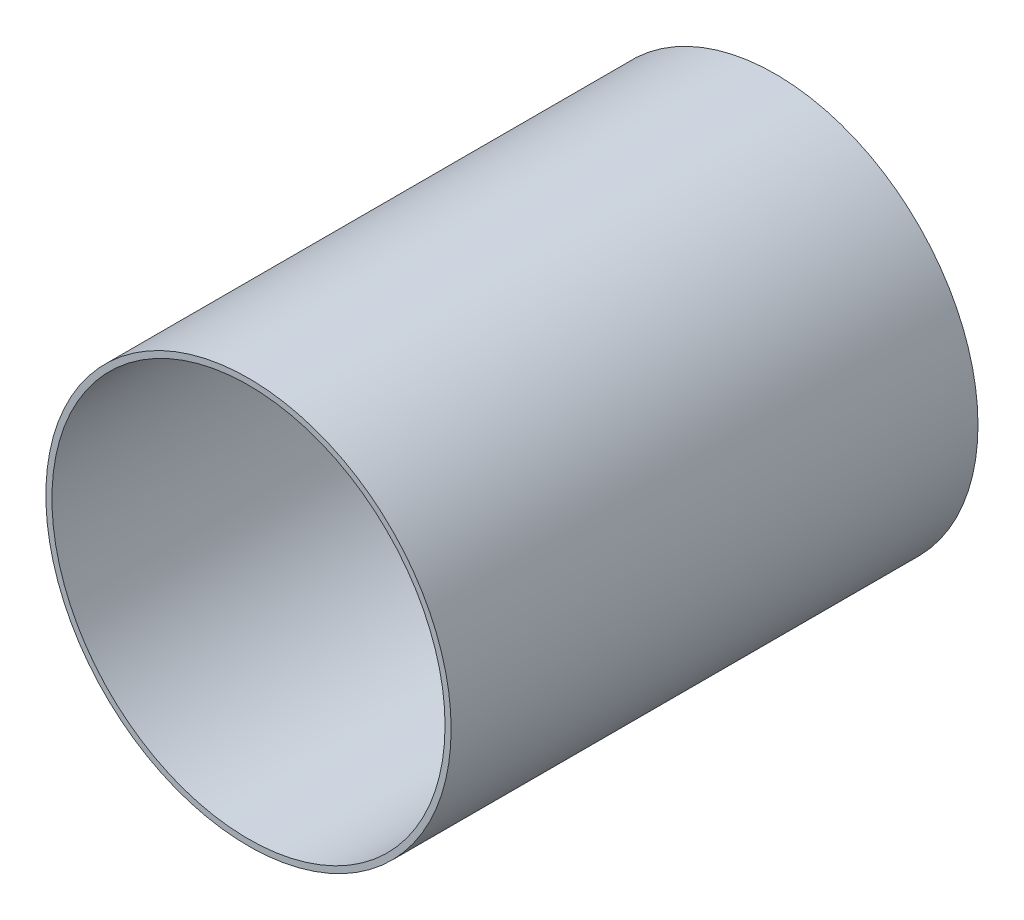
ISO-10303-21;
HEADER;
FILE_DESCRIPTION(('STEP AP214'),'2;1');
FILE_NAME('part.step','',(''),(''),'','','');
FILE_SCHEMA(('AUTOMOTIVE_DESIGN { 1 0 10303 214 1 1 1 1 }'));
ENDSEC;
DATA;
#1=APPLICATION_CONTEXT('core data for automotive mechanical design processes');
#2=APPLICATION_PROTOCOL_DEFINITION('international standard','automotive_design',2000,#1);
#3=PRODUCT_CONTEXT('',#1,'mechanical');
#4=PRODUCT('Part','Part','',(#3));
#5=PRODUCT_RELATED_PRODUCT_CATEGORY('part','',(#4));
#6=PRODUCT_DEFINITION_FORMATION('','',#4);
#7=PRODUCT_DEFINITION_CONTEXT('part definition',#1,'design');
#8=PRODUCT_DEFINITION('design','',#6,#7);
#9=PRODUCT_DEFINITION_SHAPE('','',#8);
#10=(LENGTH_UNIT() NAMED_UNIT(*) SI_UNIT(.MILLI.,.METRE.));
#11=(NAMED_UNIT(*) PLANE_ANGLE_UNIT() SI_UNIT($,.RADIAN.));
#12=(NAMED_UNIT(*) SI_UNIT($,.STERADIAN.) SOLID_ANGLE_UNIT());
#13=UNCERTAINTY_MEASURE_WITH_UNIT(LENGTH_MEASURE(1.E-05),#10,'distance_accuracy_value','');
#14=(GEOMETRIC_REPRESENTATION_CONTEXT(3) GLOBAL_UNCERTAINTY_ASSIGNED_CONTEXT((#13)) GLOBAL_UNIT_ASSIGNED_CONTEXT((#10,
#11,#12)) REPRESENTATION_CONTEXT('',''));
#15=CARTESIAN_POINT('',(0.,0.,0.));
#16=DIRECTION('',(0.,0.,1.));
#17=DIRECTION('',(1.,0.,0.));
#18=AXIS2_PLACEMENT_3D('',#15,#16,#17);
#19=CARTESIAN_POINT('',(0.,0.,130.));
#20=DIRECTION('',(0.,0.,1.));
#21=DIRECTION('',(1.,0.,0.));
#22=AXIS2_PLACEMENT_3D('',#19,#20,#21);
#23=PLANE('',#22);
#24=CARTESIAN_POINT('',(0.,0.,130.));
#25=DIRECTION('',(0.,0.,1.));
#26=DIRECTION('',(1.,0.,0.));
#27=AXIS2_PLACEMENT_3D('',#24,#25,#26);
#28=CIRCLE('',#27,50.);
#29=CARTESIAN_POINT('',(50.,0.,130.));
#30=VERTEX_POINT('',#29);
#31=EDGE_CURVE('E10',#30,#30,#28,.T.);
#32=ORIENTED_EDGE('',*,*,#31,.T.);
#33=EDGE_LOOP('',(#32));
#34=FACE_BOUND('',#33,.T.);
#35=CARTESIAN_POINT('',(0.,0.,130.));
#36=DIRECTION('',(0.,0.,1.));
#37=DIRECTION('',(1.,0.,0.));
#38=AXIS2_PLACEMENT_3D('',#35,#36,#37);
#39=CIRCLE('',#38,48.5);
#40=CARTESIAN_POINT('',(48.5,0.,130.));
#41=VERTEX_POINT('',#40);
#42=EDGE_CURVE('E44',#41,#41,#39,.F.);
#43=ORIENTED_EDGE('',*,*,#42,.T.);
#44=EDGE_LOOP('',(#43));
#45=FACE_BOUND('',#44,.T.);
#46=ADVANCED_FACE('F33',(#34,#45),#23,.T.);
#47=CARTESIAN_POINT('',(0.,0.,0.));
#48=DIRECTION('',(0.,0.,1.));
#49=DIRECTION('',(1.,0.,0.));
#50=AXIS2_PLACEMENT_3D('',#47,#48,#49);
#51=PLANE('',#50);
#52=CARTESIAN_POINT('',(0.,0.,0.));
#53=DIRECTION('',(0.,0.,1.));
#54=DIRECTION('',(1.,0.,0.));
#55=AXIS2_PLACEMENT_3D('',#52,#53,#54);
#56=CIRCLE('',#55,50.);
#57=CARTESIAN_POINT('',(50.,0.,0.));
#58=VERTEX_POINT('',#57);
#59=EDGE_CURVE('E37',#58,#58,#56,.T.);
#60=ORIENTED_EDGE('',*,*,#59,.F.);
#61=EDGE_LOOP('',(#60));
#62=FACE_BOUND('',#61,.T.);
#63=CARTESIAN_POINT('',(0.,0.,0.));
#64=DIRECTION('',(0.,0.,1.));
#65=DIRECTION('',(1.,0.,0.));
#66=AXIS2_PLACEMENT_3D('',#63,#64,#65);
#67=CIRCLE('',#66,48.5);
#68=CARTESIAN_POINT('',(48.5,0.,0.));
#69=VERTEX_POINT('',#68);
#70=EDGE_CURVE('E48',#69,#69,#67,.T.);
#71=ORIENTED_EDGE('',*,*,#70,.T.);
#72=EDGE_LOOP('',(#71));
#73=FACE_BOUND('',#72,.T.);
#74=ADVANCED_FACE('F52',(#62,#73),#51,.F.);
#75=CARTESIAN_POINT('',(0.,0.,130.));
#76=DIRECTION('',(0.,0.,-1.));
#77=DIRECTION('',(-1.,0.,0.));
#78=AXIS2_PLACEMENT_3D('',#75,#76,#77);
#79=CYLINDRICAL_SURFACE('',#78,50.);
#80=ORIENTED_EDGE('',*,*,#31,.F.);
#81=EDGE_LOOP('',(#80));
#82=FACE_BOUND('',#81,.T.);
#83=ORIENTED_EDGE('',*,*,#59,.T.);
#84=EDGE_LOOP('',(#83));
#85=FACE_BOUND('',#84,.T.);
#86=ADVANCED_FACE('F35',(#82,#85),#79,.T.);
#87=CARTESIAN_POINT('',(0.,0.,193.));
#88=DIRECTION('',(0.,0.,-1.));
#89=DIRECTION('',(-1.,0.,0.));
#90=AXIS2_PLACEMENT_3D('',#87,#88,#89);
#91=CYLINDRICAL_SURFACE('',#90,48.5);
#92=ORIENTED_EDGE('',*,*,#42,.F.);
#93=EDGE_LOOP('',(#92));
#94=FACE_BOUND('',#93,.T.);
#95=ORIENTED_EDGE('',*,*,#70,.F.);
#96=EDGE_LOOP('',(#95));
#97=FACE_BOUND('',#96,.T.);
#98=ADVANCED_FACE('F54',(#94,#97),#91,.F.);
#99=CLOSED_SHELL('',(#46,#74,#86,#98));
#100=MANIFOLD_SOLID_BREP('B2',#99);
#101=ADVANCED_BREP_SHAPE_REPRESENTATION('',(#18,#100),#14);
#102=SHAPE_DEFINITION_REPRESENTATION(#9,#101);
ENDSEC;
END-ISO-10303-21;
